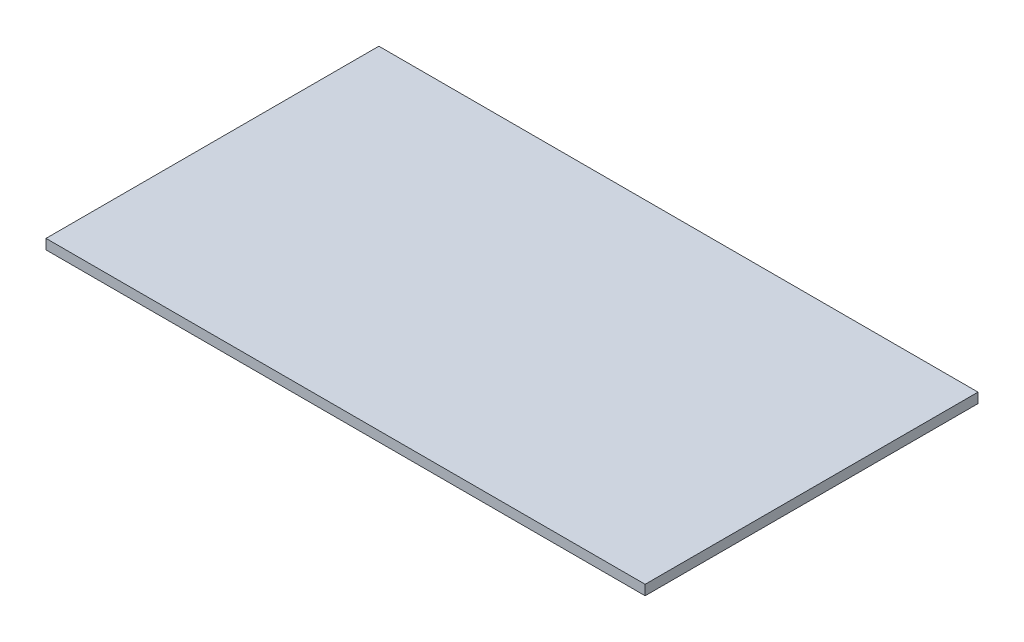
ISO-10303-21;
HEADER;
FILE_DESCRIPTION(('STEP AP214'),'2;1');
FILE_NAME('part.step','',(''),(''),'','','');
FILE_SCHEMA(('AUTOMOTIVE_DESIGN { 1 0 10303 214 1 1 1 1 }'));
ENDSEC;
DATA;
#1=APPLICATION_CONTEXT('core data for automotive mechanical design processes');
#2=APPLICATION_PROTOCOL_DEFINITION('international standard','automotive_design',2000,#1);
#3=PRODUCT_CONTEXT('',#1,'mechanical');
#4=PRODUCT('Part','Part','',(#3));
#5=PRODUCT_RELATED_PRODUCT_CATEGORY('part','',(#4));
#6=PRODUCT_DEFINITION_FORMATION('','',#4);
#7=PRODUCT_DEFINITION_CONTEXT('part definition',#1,'design');
#8=PRODUCT_DEFINITION('design','',#6,#7);
#9=PRODUCT_DEFINITION_SHAPE('','',#8);
#10=(LENGTH_UNIT() NAMED_UNIT(*) SI_UNIT(.MILLI.,.METRE.));
#11=(NAMED_UNIT(*) PLANE_ANGLE_UNIT() SI_UNIT($,.RADIAN.));
#12=(NAMED_UNIT(*) SI_UNIT($,.STERADIAN.) SOLID_ANGLE_UNIT());
#13=UNCERTAINTY_MEASURE_WITH_UNIT(LENGTH_MEASURE(1.E-05),#10,'distance_accuracy_value','');
#14=(GEOMETRIC_REPRESENTATION_CONTEXT(3) GLOBAL_UNCERTAINTY_ASSIGNED_CONTEXT((#13)) GLOBAL_UNIT_ASSIGNED_CONTEXT((#10,
#11,#12)) REPRESENTATION_CONTEXT('',''));
#15=CARTESIAN_POINT('',(0.,0.,0.));
#16=DIRECTION('',(0.,0.,1.));
#17=DIRECTION('',(1.,0.,0.));
#18=AXIS2_PLACEMENT_3D('',#15,#16,#17);
#19=CARTESIAN_POINT('',(0.,1.5,0.));
#20=DIRECTION('',(1.,0.,0.));
#21=DIRECTION('',(0.,0.,-1.));
#22=AXIS2_PLACEMENT_3D('',#19,#20,#21);
#23=PLANE('',#22);
#24=DIRECTION('',(0.,0.,1.));
#25=VECTOR('',#24,1.);
#26=CARTESIAN_POINT('',(0.,0.,0.));
#27=LINE('',#26,#25);
#28=CARTESIAN_POINT('',(0.,0.,-50.));
#29=VERTEX_POINT('',#28);
#30=CARTESIAN_POINT('',(0.,0.,0.));
#31=VERTEX_POINT('',#30);
#32=EDGE_CURVE('E107',#29,#31,#27,.T.);
#33=ORIENTED_EDGE('',*,*,#32,.T.);
#34=DIRECTION('',(0.,-1.,0.));
#35=VECTOR('',#34,1.);
#36=CARTESIAN_POINT('',(0.,1.5,0.));
#37=LINE('',#36,#35);
#38=CARTESIAN_POINT('',(0.,1.5,0.));
#39=VERTEX_POINT('',#38);
#40=EDGE_CURVE('E11',#39,#31,#37,.T.);
#41=ORIENTED_EDGE('',*,*,#40,.F.);
#42=DIRECTION('',(0.,0.,1.));
#43=VECTOR('',#42,1.);
#44=CARTESIAN_POINT('',(0.,1.5,0.));
#45=LINE('',#44,#43);
#46=CARTESIAN_POINT('',(0.,1.5,-50.));
#47=VERTEX_POINT('',#46);
#48=EDGE_CURVE('E91',#47,#39,#45,.T.);
#49=ORIENTED_EDGE('',*,*,#48,.F.);
#50=DIRECTION('',(0.,-1.,0.));
#51=VECTOR('',#50,1.);
#52=CARTESIAN_POINT('',(0.,1.5,-50.));
#53=LINE('',#52,#51);
#54=EDGE_CURVE('E103',#47,#29,#53,.T.);
#55=ORIENTED_EDGE('',*,*,#54,.T.);
#56=EDGE_LOOP('',(#33,#41,#49,#55));
#57=FACE_BOUND('',#56,.T.);
#58=ADVANCED_FACE('F39',(#57),#23,.F.);
#59=CARTESIAN_POINT('',(0.,1.5,0.));
#60=DIRECTION('',(0.,0.,-1.));
#61=DIRECTION('',(-1.,0.,0.));
#62=AXIS2_PLACEMENT_3D('',#59,#60,#61);
#63=PLANE('',#62);
#64=DIRECTION('',(1.,0.,0.));
#65=VECTOR('',#64,1.);
#66=CARTESIAN_POINT('',(0.,0.,0.));
#67=LINE('',#66,#65);
#68=CARTESIAN_POINT('',(90.,0.,0.));
#69=VERTEX_POINT('',#68);
#70=EDGE_CURVE('E96',#31,#69,#67,.T.);
#71=ORIENTED_EDGE('',*,*,#70,.T.);
#72=DIRECTION('',(0.,-1.,0.));
#73=VECTOR('',#72,1.);
#74=CARTESIAN_POINT('',(90.,1.5,0.));
#75=LINE('',#74,#73);
#76=CARTESIAN_POINT('',(90.,1.5,0.));
#77=VERTEX_POINT('',#76);
#78=EDGE_CURVE('E48',#77,#69,#75,.T.);
#79=ORIENTED_EDGE('',*,*,#78,.F.);
#80=DIRECTION('',(1.,0.,0.));
#81=VECTOR('',#80,1.);
#82=CARTESIAN_POINT('',(0.,1.5,0.));
#83=LINE('',#82,#81);
#84=EDGE_CURVE('E86',#39,#77,#83,.T.);
#85=ORIENTED_EDGE('',*,*,#84,.F.);
#86=ORIENTED_EDGE('',*,*,#40,.T.);
#87=EDGE_LOOP('',(#71,#79,#85,#86));
#88=FACE_BOUND('',#87,.T.);
#89=ADVANCED_FACE('F95',(#88),#63,.F.);
#90=CARTESIAN_POINT('',(90.,1.5,0.));
#91=DIRECTION('',(-1.,0.,0.));
#92=DIRECTION('',(0.,0.,1.));
#93=AXIS2_PLACEMENT_3D('',#90,#91,#92);
#94=PLANE('',#93);
#95=DIRECTION('',(0.,0.,-1.));
#96=VECTOR('',#95,1.);
#97=CARTESIAN_POINT('',(90.,0.,0.));
#98=LINE('',#97,#96);
#99=CARTESIAN_POINT('',(90.,0.,-50.));
#100=VERTEX_POINT('',#99);
#101=EDGE_CURVE('E73',#69,#100,#98,.T.);
#102=ORIENTED_EDGE('',*,*,#101,.T.);
#103=DIRECTION('',(0.,-1.,0.));
#104=VECTOR('',#103,1.);
#105=CARTESIAN_POINT('',(90.,1.5,-50.));
#106=LINE('',#105,#104);
#107=CARTESIAN_POINT('',(90.,1.5,-50.));
#108=VERTEX_POINT('',#107);
#109=EDGE_CURVE('E98',#108,#100,#106,.T.);
#110=ORIENTED_EDGE('',*,*,#109,.F.);
#111=DIRECTION('',(0.,0.,-1.));
#112=VECTOR('',#111,1.);
#113=CARTESIAN_POINT('',(90.,1.5,0.));
#114=LINE('',#113,#112);
#115=EDGE_CURVE('E89',#77,#108,#114,.T.);
#116=ORIENTED_EDGE('',*,*,#115,.F.);
#117=ORIENTED_EDGE('',*,*,#78,.T.);
#118=EDGE_LOOP('',(#102,#110,#116,#117));
#119=FACE_BOUND('',#118,.T.);
#120=ADVANCED_FACE('F99',(#119),#94,.F.);
#121=CARTESIAN_POINT('',(0.,1.5,-50.));
#122=DIRECTION('',(0.,0.,1.));
#123=DIRECTION('',(1.,0.,0.));
#124=AXIS2_PLACEMENT_3D('',#121,#122,#123);
#125=PLANE('',#124);
#126=DIRECTION('',(-1.,0.,0.));
#127=VECTOR('',#126,1.);
#128=CARTESIAN_POINT('',(0.,0.,-50.));
#129=LINE('',#128,#127);
#130=EDGE_CURVE('E79',#100,#29,#129,.T.);
#131=ORIENTED_EDGE('',*,*,#130,.T.);
#132=ORIENTED_EDGE('',*,*,#54,.F.);
#133=DIRECTION('',(-1.,0.,0.));
#134=VECTOR('',#133,1.);
#135=CARTESIAN_POINT('',(0.,1.5,-50.));
#136=LINE('',#135,#134);
#137=EDGE_CURVE('E56',#108,#47,#136,.T.);
#138=ORIENTED_EDGE('',*,*,#137,.F.);
#139=ORIENTED_EDGE('',*,*,#109,.T.);
#140=EDGE_LOOP('',(#131,#132,#138,#139));
#141=FACE_BOUND('',#140,.T.);
#142=ADVANCED_FACE('F120',(#141),#125,.F.);
#143=CARTESIAN_POINT('',(0.,1.5,0.));
#144=DIRECTION('',(0.,-1.,0.));
#145=DIRECTION('',(0.,0.,-1.));
#146=AXIS2_PLACEMENT_3D('',#143,#144,#145);
#147=PLANE('',#146);
#148=ORIENTED_EDGE('',*,*,#48,.T.);
#149=ORIENTED_EDGE('',*,*,#84,.T.);
#150=ORIENTED_EDGE('',*,*,#115,.T.);
#151=ORIENTED_EDGE('',*,*,#137,.T.);
#152=EDGE_LOOP('',(#148,#149,#150,#151));
#153=FACE_BOUND('',#152,.T.);
#154=ADVANCED_FACE('F87',(#153),#147,.F.);
#155=CARTESIAN_POINT('',(0.,0.,0.));
#156=DIRECTION('',(0.,-1.,0.));
#157=DIRECTION('',(0.,0.,-1.));
#158=AXIS2_PLACEMENT_3D('',#155,#156,#157);
#159=PLANE('',#158);
#160=ORIENTED_EDGE('',*,*,#32,.F.);
#161=ORIENTED_EDGE('',*,*,#130,.F.);
#162=ORIENTED_EDGE('',*,*,#101,.F.);
#163=ORIENTED_EDGE('',*,*,#70,.F.);
#164=EDGE_LOOP('',(#160,#161,#162,#163));
#165=FACE_BOUND('',#164,.T.);
#166=ADVANCED_FACE('F123',(#165),#159,.T.);
#167=CLOSED_SHELL('',(#58,#89,#120,#142,#154,#166));
#168=MANIFOLD_SOLID_BREP('B2',#167);
#169=ADVANCED_BREP_SHAPE_REPRESENTATION('',(#18,#168),#14);
#170=SHAPE_DEFINITION_REPRESENTATION(#9,#169);
ENDSEC;
END-ISO-10303-21;
